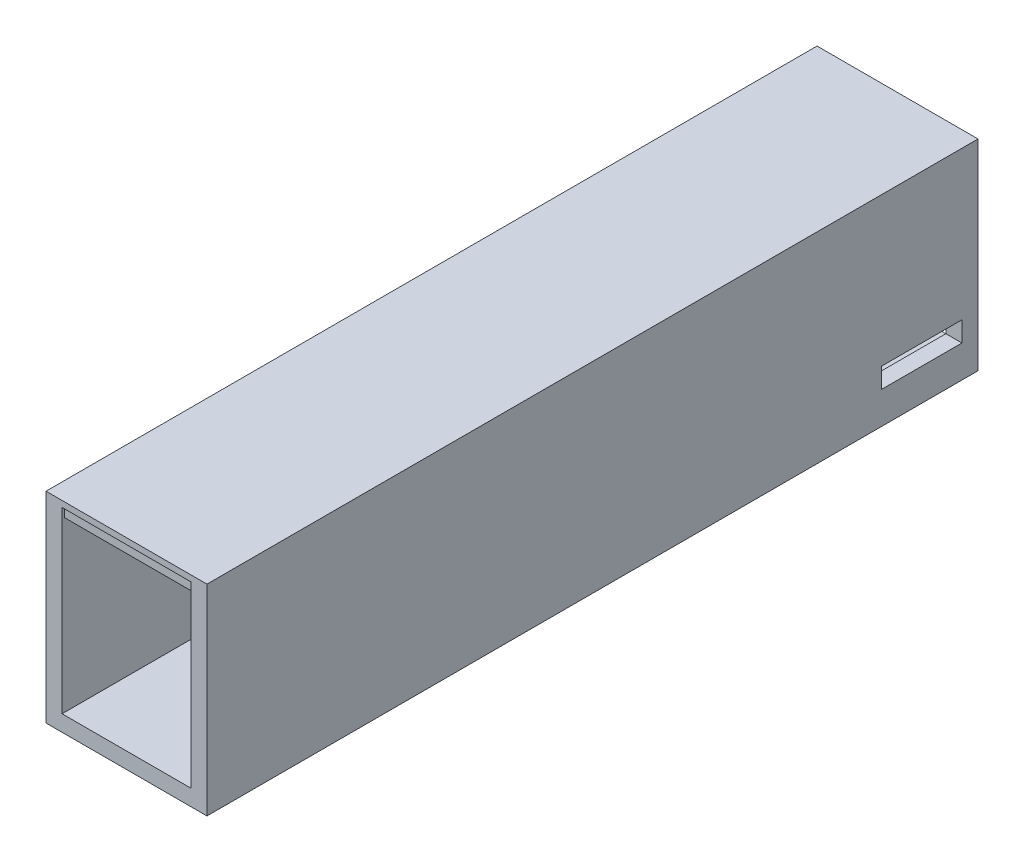
ISO-10303-21;
HEADER;
FILE_DESCRIPTION(('STEP AP214'),'2;1');
FILE_NAME('part.step','',(''),(''),'','','');
FILE_SCHEMA(('AUTOMOTIVE_DESIGN { 1 0 10303 214 1 1 1 1 }'));
ENDSEC;
DATA;
#1=APPLICATION_CONTEXT('core data for automotive mechanical design processes');
#2=APPLICATION_PROTOCOL_DEFINITION('international standard','automotive_design',2000,#1);
#3=PRODUCT_CONTEXT('',#1,'mechanical');
#4=PRODUCT('Part','Part','',(#3));
#5=PRODUCT_RELATED_PRODUCT_CATEGORY('part','',(#4));
#6=PRODUCT_DEFINITION_FORMATION('','',#4);
#7=PRODUCT_DEFINITION_CONTEXT('part definition',#1,'design');
#8=PRODUCT_DEFINITION('design','',#6,#7);
#9=PRODUCT_DEFINITION_SHAPE('','',#8);
#10=(LENGTH_UNIT() NAMED_UNIT(*) SI_UNIT(.MILLI.,.METRE.));
#11=(NAMED_UNIT(*) PLANE_ANGLE_UNIT() SI_UNIT($,.RADIAN.));
#12=(NAMED_UNIT(*) SI_UNIT($,.STERADIAN.) SOLID_ANGLE_UNIT());
#13=UNCERTAINTY_MEASURE_WITH_UNIT(LENGTH_MEASURE(1.E-05),#10,'distance_accuracy_value','');
#14=(GEOMETRIC_REPRESENTATION_CONTEXT(3) GLOBAL_UNCERTAINTY_ASSIGNED_CONTEXT((#13)) GLOBAL_UNIT_ASSIGNED_CONTEXT((#10,
#11,#12)) REPRESENTATION_CONTEXT('',''));
#15=CARTESIAN_POINT('',(0.,0.,0.));
#16=DIRECTION('',(0.,0.,1.));
#17=DIRECTION('',(1.,0.,0.));
#18=AXIS2_PLACEMENT_3D('',#15,#16,#17);
#19=CARTESIAN_POINT('',(-42.7005767012687,130.044257703081,480.));
#20=DIRECTION('',(0.,-1.,0.));
#21=DIRECTION('',(0.,0.,-1.));
#22=AXIS2_PLACEMENT_3D('',#19,#20,#21);
#23=PLANE('',#22);
#24=DIRECTION('',(0.,0.,-1.));
#25=VECTOR('',#24,1.);
#26=CARTESIAN_POINT('',(-42.7005767012687,130.044257703081,480.));
#27=LINE('',#26,#25);
#28=CARTESIAN_POINT('',(-42.7005767012687,130.044257703081,477.));
#29=VERTEX_POINT('',#28);
#30=CARTESIAN_POINT('',(-42.7005767012687,130.044257703081,-477.));
#31=VERTEX_POINT('',#30);
#32=EDGE_CURVE('E291',#29,#31,#27,.T.);
#33=ORIENTED_EDGE('',*,*,#32,.T.);
#34=DIRECTION('',(1.,0.,0.));
#35=VECTOR('',#34,1.);
#36=CARTESIAN_POINT('',(-42.7005767012687,130.044257703081,-477.));
#37=LINE('',#36,#35);
#38=CARTESIAN_POINT('',(117.699423298731,130.044257703081,-477.));
#39=VERTEX_POINT('',#38);
#40=EDGE_CURVE('E245',#31,#39,#37,.T.);
#41=ORIENTED_EDGE('',*,*,#40,.T.);
#42=DIRECTION('',(0.,0.,-1.));
#43=VECTOR('',#42,1.);
#44=CARTESIAN_POINT('',(117.699423298731,130.044257703081,480.));
#45=LINE('',#44,#43);
#46=CARTESIAN_POINT('',(117.699423298731,130.044257703081,477.));
#47=VERTEX_POINT('',#46);
#48=EDGE_CURVE('E278',#47,#39,#45,.T.);
#49=ORIENTED_EDGE('',*,*,#48,.F.);
#50=DIRECTION('',(-1.,0.,0.));
#51=VECTOR('',#50,1.);
#52=CARTESIAN_POINT('',(-42.7005767012687,130.044257703081,477.));
#53=LINE('',#52,#51);
#54=EDGE_CURVE('E264',#47,#29,#53,.T.);
#55=ORIENTED_EDGE('',*,*,#54,.T.);
#56=EDGE_LOOP('',(#33,#41,#49,#55));
#57=FACE_BOUND('',#56,.T.);
#58=ADVANCED_FACE('F37',(#57),#23,.T.);
#59=CARTESIAN_POINT('',(0.,0.,-480.));
#60=DIRECTION('',(0.,0.,1.));
#61=DIRECTION('',(1.,0.,0.));
#62=AXIS2_PLACEMENT_3D('',#59,#60,#61);
#63=PLANE('',#62);
#64=DIRECTION('',(-1.,0.,0.));
#65=VECTOR('',#64,1.);
#66=CARTESIAN_POINT('',(-62.7005767012687,150.044257703081,-480.));
#67=LINE('',#66,#65);
#68=CARTESIAN_POINT('',(137.699423298731,150.044257703081,-480.));
#69=VERTEX_POINT('',#68);
#70=CARTESIAN_POINT('',(-62.7005767012687,150.044257703081,-480.));
#71=VERTEX_POINT('',#70);
#72=EDGE_CURVE('E294',#69,#71,#67,.T.);
#73=ORIENTED_EDGE('',*,*,#72,.F.);
#74=DIRECTION('',(0.,1.,0.));
#75=VECTOR('',#74,1.);
#76=CARTESIAN_POINT('',(137.699423298731,-99.9557422969188,-480.));
#77=LINE('',#76,#75);
#78=CARTESIAN_POINT('',(137.699423298731,-99.9557422969188,-480.));
#79=VERTEX_POINT('',#78);
#80=EDGE_CURVE('E299',#79,#69,#77,.T.);
#81=ORIENTED_EDGE('',*,*,#80,.F.);
#82=DIRECTION('',(1.,0.,0.));
#83=VECTOR('',#82,1.);
#84=CARTESIAN_POINT('',(-62.7005767012687,-99.9557422969188,-480.));
#85=LINE('',#84,#83);
#86=CARTESIAN_POINT('',(-62.7005767012687,-99.9557422969188,-480.));
#87=VERTEX_POINT('',#86);
#88=EDGE_CURVE('E310',#87,#79,#85,.T.);
#89=ORIENTED_EDGE('',*,*,#88,.F.);
#90=DIRECTION('',(0.,-1.,0.));
#91=VECTOR('',#90,1.);
#92=CARTESIAN_POINT('',(-62.7005767012687,150.044257703081,-480.));
#93=LINE('',#92,#91);
#94=EDGE_CURVE('E308',#71,#87,#93,.T.);
#95=ORIENTED_EDGE('',*,*,#94,.F.);
#96=EDGE_LOOP('',(#73,#81,#89,#95));
#97=FACE_BOUND('',#96,.T.);
#98=DIRECTION('',(-1.,0.,0.));
#99=VECTOR('',#98,1.);
#100=CARTESIAN_POINT('',(-42.7005767012687,142.544257703081,-480.));
#101=LINE('',#100,#99);
#102=CARTESIAN_POINT('',(117.699423298731,142.544257703081,-480.));
#103=VERTEX_POINT('',#102);
#104=CARTESIAN_POINT('',(-42.7005767012687,142.544257703081,-480.));
#105=VERTEX_POINT('',#104);
#106=EDGE_CURVE('E231',#103,#105,#101,.T.);
#107=ORIENTED_EDGE('',*,*,#106,.T.);
#108=DIRECTION('',(0.,-1.,0.));
#109=VECTOR('',#108,1.);
#110=CARTESIAN_POINT('',(-42.7005767012687,130.044257703081,-480.));
#111=LINE('',#110,#109);
#112=CARTESIAN_POINT('',(-42.7005767012687,-79.9557422969188,-480.));
#113=VERTEX_POINT('',#112);
#114=EDGE_CURVE('E269',#105,#113,#111,.T.);
#115=ORIENTED_EDGE('',*,*,#114,.T.);
#116=DIRECTION('',(1.,0.,0.));
#117=VECTOR('',#116,1.);
#118=CARTESIAN_POINT('',(-42.7005767012687,-79.9557422969188,-480.));
#119=LINE('',#118,#117);
#120=CARTESIAN_POINT('',(117.699423298731,-79.9557422969188,-480.));
#121=VERTEX_POINT('',#120);
#122=EDGE_CURVE('E280',#113,#121,#119,.T.);
#123=ORIENTED_EDGE('',*,*,#122,.T.);
#124=DIRECTION('',(0.,1.,0.));
#125=VECTOR('',#124,1.);
#126=CARTESIAN_POINT('',(117.699423298731,-79.9557422969188,-480.));
#127=LINE('',#126,#125);
#128=EDGE_CURVE('E273',#121,#103,#127,.T.);
#129=ORIENTED_EDGE('',*,*,#128,.T.);
#130=EDGE_LOOP('',(#107,#115,#123,#129));
#131=FACE_BOUND('',#130,.T.);
#132=ADVANCED_FACE('F367',(#97,#131),#63,.F.);
#133=CARTESIAN_POINT('',(0.,0.,480.));
#134=DIRECTION('',(0.,0.,1.));
#135=DIRECTION('',(1.,0.,0.));
#136=AXIS2_PLACEMENT_3D('',#133,#134,#135);
#137=PLANE('',#136);
#138=DIRECTION('',(0.,-1.,0.));
#139=VECTOR('',#138,1.);
#140=CARTESIAN_POINT('',(-42.7005767012687,130.044257703081,480.));
#141=LINE('',#140,#139);
#142=CARTESIAN_POINT('',(-42.7005767012687,142.544257703081,480.));
#143=VERTEX_POINT('',#142);
#144=CARTESIAN_POINT('',(-42.7005767012687,-79.9557422969188,480.));
#145=VERTEX_POINT('',#144);
#146=EDGE_CURVE('E270',#143,#145,#141,.T.);
#147=ORIENTED_EDGE('',*,*,#146,.F.);
#148=DIRECTION('',(-1.,0.,0.));
#149=VECTOR('',#148,1.);
#150=CARTESIAN_POINT('',(-42.7005767012687,142.544257703081,480.));
#151=LINE('',#150,#149);
#152=CARTESIAN_POINT('',(117.699423298731,142.544257703081,480.));
#153=VERTEX_POINT('',#152);
#154=EDGE_CURVE('E250',#153,#143,#151,.T.);
#155=ORIENTED_EDGE('',*,*,#154,.F.);
#156=DIRECTION('',(0.,1.,0.));
#157=VECTOR('',#156,1.);
#158=CARTESIAN_POINT('',(117.699423298731,-79.9557422969188,480.));
#159=LINE('',#158,#157);
#160=CARTESIAN_POINT('',(117.699423298731,-79.9557422969188,480.));
#161=VERTEX_POINT('',#160);
#162=EDGE_CURVE('E276',#161,#153,#159,.T.);
#163=ORIENTED_EDGE('',*,*,#162,.F.);
#164=DIRECTION('',(1.,0.,0.));
#165=VECTOR('',#164,1.);
#166=CARTESIAN_POINT('',(-42.7005767012687,-79.9557422969188,480.));
#167=LINE('',#166,#165);
#168=EDGE_CURVE('E272',#145,#161,#167,.T.);
#169=ORIENTED_EDGE('',*,*,#168,.F.);
#170=EDGE_LOOP('',(#147,#155,#163,#169));
#171=FACE_BOUND('',#170,.T.);
#172=DIRECTION('',(-1.,0.,0.));
#173=VECTOR('',#172,1.);
#174=CARTESIAN_POINT('',(-62.7005767012687,150.044257703081,480.));
#175=LINE('',#174,#173);
#176=CARTESIAN_POINT('',(137.699423298731,150.044257703081,480.));
#177=VERTEX_POINT('',#176);
#178=CARTESIAN_POINT('',(-62.7005767012687,150.044257703081,480.));
#179=VERTEX_POINT('',#178);
#180=EDGE_CURVE('E295',#177,#179,#175,.T.);
#181=ORIENTED_EDGE('',*,*,#180,.T.);
#182=DIRECTION('',(0.,-1.,0.));
#183=VECTOR('',#182,1.);
#184=CARTESIAN_POINT('',(-62.7005767012687,150.044257703081,480.));
#185=LINE('',#184,#183);
#186=CARTESIAN_POINT('',(-62.7005767012687,-99.9557422969188,480.));
#187=VERTEX_POINT('',#186);
#188=EDGE_CURVE('E298',#179,#187,#185,.T.);
#189=ORIENTED_EDGE('',*,*,#188,.T.);
#190=DIRECTION('',(1.,0.,0.));
#191=VECTOR('',#190,1.);
#192=CARTESIAN_POINT('',(-62.7005767012687,-99.9557422969188,480.));
#193=LINE('',#192,#191);
#194=CARTESIAN_POINT('',(137.699423298731,-99.9557422969188,480.));
#195=VERTEX_POINT('',#194);
#196=EDGE_CURVE('E301',#187,#195,#193,.T.);
#197=ORIENTED_EDGE('',*,*,#196,.T.);
#198=DIRECTION('',(0.,1.,0.));
#199=VECTOR('',#198,1.);
#200=CARTESIAN_POINT('',(137.699423298731,-99.9557422969188,480.));
#201=LINE('',#200,#199);
#202=EDGE_CURVE('E303',#195,#177,#201,.T.);
#203=ORIENTED_EDGE('',*,*,#202,.T.);
#204=EDGE_LOOP('',(#181,#189,#197,#203));
#205=FACE_BOUND('',#204,.T.);
#206=ADVANCED_FACE('F373',(#171,#205),#137,.T.);
#207=CARTESIAN_POINT('',(-62.7005767012687,150.044257703081,480.));
#208=DIRECTION('',(0.,-1.,0.));
#209=DIRECTION('',(0.,0.,-1.));
#210=AXIS2_PLACEMENT_3D('',#207,#208,#209);
#211=PLANE('',#210);
#212=ORIENTED_EDGE('',*,*,#72,.T.);
#213=DIRECTION('',(0.,0.,-1.));
#214=VECTOR('',#213,1.);
#215=CARTESIAN_POINT('',(-62.7005767012687,150.044257703081,480.));
#216=LINE('',#215,#214);
#217=EDGE_CURVE('E321',#179,#71,#216,.T.);
#218=ORIENTED_EDGE('',*,*,#217,.F.);
#219=ORIENTED_EDGE('',*,*,#180,.F.);
#220=DIRECTION('',(0.,0.,-1.));
#221=VECTOR('',#220,1.);
#222=CARTESIAN_POINT('',(137.699423298731,150.044257703081,480.));
#223=LINE('',#222,#221);
#224=EDGE_CURVE('E305',#177,#69,#223,.T.);
#225=ORIENTED_EDGE('',*,*,#224,.T.);
#226=EDGE_LOOP('',(#212,#218,#219,#225));
#227=FACE_BOUND('',#226,.T.);
#228=ADVANCED_FACE('F39',(#227),#211,.F.);
#229=CARTESIAN_POINT('',(-62.7005767012687,150.044257703081,480.));
#230=DIRECTION('',(1.,0.,0.));
#231=DIRECTION('',(0.,0.,-1.));
#232=AXIS2_PLACEMENT_3D('',#229,#230,#231);
#233=PLANE('',#232);
#234=DIRECTION('',(0.,0.,1.));
#235=VECTOR('',#234,1.);
#236=CARTESIAN_POINT('',(-62.7005767012687,-34.9557422969188,-360.));
#237=LINE('',#236,#235);
#238=CARTESIAN_POINT('',(-62.7005767012687,-34.9557422969188,-460.));
#239=VERTEX_POINT('',#238);
#240=CARTESIAN_POINT('',(-62.7005767012687,-34.9557422969188,-360.));
#241=VERTEX_POINT('',#240);
#242=EDGE_CURVE('E210',#239,#241,#237,.T.);
#243=ORIENTED_EDGE('',*,*,#242,.T.);
#244=DIRECTION('',(0.,-1.,0.));
#245=VECTOR('',#244,1.);
#246=CARTESIAN_POINT('',(-62.7005767012687,-34.9557422969188,-360.));
#247=LINE('',#246,#245);
#248=CARTESIAN_POINT('',(-62.7005767012687,-59.9557422969188,-360.));
#249=VERTEX_POINT('',#248);
#250=EDGE_CURVE('E200',#241,#249,#247,.T.);
#251=ORIENTED_EDGE('',*,*,#250,.T.);
#252=DIRECTION('',(0.,0.,-1.));
#253=VECTOR('',#252,1.);
#254=CARTESIAN_POINT('',(-62.7005767012687,-59.9557422969188,-360.));
#255=LINE('',#254,#253);
#256=CARTESIAN_POINT('',(-62.7005767012687,-59.9557422969188,-460.));
#257=VERTEX_POINT('',#256);
#258=EDGE_CURVE('E206',#249,#257,#255,.T.);
#259=ORIENTED_EDGE('',*,*,#258,.T.);
#260=DIRECTION('',(0.,1.,0.));
#261=VECTOR('',#260,1.);
#262=CARTESIAN_POINT('',(-62.7005767012687,-34.9557422969188,-460.));
#263=LINE('',#262,#261);
#264=EDGE_CURVE('E52',#257,#239,#263,.T.);
#265=ORIENTED_EDGE('',*,*,#264,.T.);
#266=EDGE_LOOP('',(#243,#251,#259,#265));
#267=FACE_BOUND('',#266,.T.);
#268=ORIENTED_EDGE('',*,*,#94,.T.);
#269=DIRECTION('',(0.,0.,-1.));
#270=VECTOR('',#269,1.);
#271=CARTESIAN_POINT('',(-62.7005767012687,-99.9557422969188,480.));
#272=LINE('',#271,#270);
#273=EDGE_CURVE('E318',#187,#87,#272,.T.);
#274=ORIENTED_EDGE('',*,*,#273,.F.);
#275=ORIENTED_EDGE('',*,*,#188,.F.);
#276=ORIENTED_EDGE('',*,*,#217,.T.);
#277=EDGE_LOOP('',(#268,#274,#275,#276));
#278=FACE_BOUND('',#277,.T.);
#279=ADVANCED_FACE('F354',(#267,#278),#233,.F.);
#280=CARTESIAN_POINT('',(-62.7005767012687,-99.9557422969188,480.));
#281=DIRECTION('',(0.,1.,0.));
#282=DIRECTION('',(0.,0.,1.));
#283=AXIS2_PLACEMENT_3D('',#280,#281,#282);
#284=PLANE('',#283);
#285=CARTESIAN_POINT('',(112.499423298731,-99.9557422969188,0.));
#286=DIRECTION('',(0.,-1.,0.));
#287=DIRECTION('',(0.,0.,-1.));
#288=AXIS2_PLACEMENT_3D('',#285,#286,#287);
#289=CIRCLE('',#288,1.5);
#290=CARTESIAN_POINT('',(112.499423298731,-99.9557422969188,-1.49999999999997));
#291=VERTEX_POINT('',#290);
#292=EDGE_CURVE('E337',#291,#291,#289,.T.);
#293=ORIENTED_EDGE('',*,*,#292,.F.);
#294=EDGE_LOOP('',(#293));
#295=FACE_BOUND('',#294,.T.);
#296=CARTESIAN_POINT('',(-37.5005767012687,-99.9557422969188,0.));
#297=DIRECTION('',(0.,-1.,0.));
#298=DIRECTION('',(0.,0.,-1.));
#299=AXIS2_PLACEMENT_3D('',#296,#297,#298);
#300=CIRCLE('',#299,1.5);
#301=CARTESIAN_POINT('',(-37.5005767012687,-99.9557422969188,-1.5));
#302=VERTEX_POINT('',#301);
#303=EDGE_CURVE('E343',#302,#302,#300,.T.);
#304=ORIENTED_EDGE('',*,*,#303,.F.);
#305=EDGE_LOOP('',(#304));
#306=FACE_BOUND('',#305,.T.);
#307=ORIENTED_EDGE('',*,*,#88,.T.);
#308=DIRECTION('',(0.,0.,-1.));
#309=VECTOR('',#308,1.);
#310=CARTESIAN_POINT('',(137.699423298731,-99.9557422969188,480.));
#311=LINE('',#310,#309);
#312=EDGE_CURVE('E315',#195,#79,#311,.T.);
#313=ORIENTED_EDGE('',*,*,#312,.F.);
#314=ORIENTED_EDGE('',*,*,#196,.F.);
#315=ORIENTED_EDGE('',*,*,#273,.T.);
#316=EDGE_LOOP('',(#307,#313,#314,#315));
#317=FACE_BOUND('',#316,.T.);
#318=ADVANCED_FACE('F351',(#295,#306,#317),#284,.F.);
#319=CARTESIAN_POINT('',(137.699423298731,-99.9557422969188,480.));
#320=DIRECTION('',(-1.,0.,0.));
#321=DIRECTION('',(0.,0.,1.));
#322=AXIS2_PLACEMENT_3D('',#319,#320,#321);
#323=PLANE('',#322);
#324=DIRECTION('',(0.,0.,-1.));
#325=VECTOR('',#324,1.);
#326=CARTESIAN_POINT('',(137.699423298731,-59.9557422969188,-360.));
#327=LINE('',#326,#325);
#328=CARTESIAN_POINT('',(137.699423298731,-59.9557422969188,-360.));
#329=VERTEX_POINT('',#328);
#330=CARTESIAN_POINT('',(137.699423298731,-59.9557422969188,-460.));
#331=VERTEX_POINT('',#330);
#332=EDGE_CURVE('E190',#329,#331,#327,.T.);
#333=ORIENTED_EDGE('',*,*,#332,.F.);
#334=DIRECTION('',(0.,-1.,0.));
#335=VECTOR('',#334,1.);
#336=CARTESIAN_POINT('',(137.699423298731,-34.9557422969188,-360.));
#337=LINE('',#336,#335);
#338=CARTESIAN_POINT('',(137.699423298731,-34.9557422969188,-360.));
#339=VERTEX_POINT('',#338);
#340=EDGE_CURVE('E60',#339,#329,#337,.T.);
#341=ORIENTED_EDGE('',*,*,#340,.F.);
#342=DIRECTION('',(0.,0.,1.));
#343=VECTOR('',#342,1.);
#344=CARTESIAN_POINT('',(137.699423298731,-34.9557422969188,-360.));
#345=LINE('',#344,#343);
#346=CARTESIAN_POINT('',(137.699423298731,-34.9557422969188,-460.));
#347=VERTEX_POINT('',#346);
#348=EDGE_CURVE('E198',#347,#339,#345,.T.);
#349=ORIENTED_EDGE('',*,*,#348,.F.);
#350=DIRECTION('',(0.,1.,0.));
#351=VECTOR('',#350,1.);
#352=CARTESIAN_POINT('',(137.699423298731,-34.9557422969188,-460.));
#353=LINE('',#352,#351);
#354=EDGE_CURVE('E180',#331,#347,#353,.T.);
#355=ORIENTED_EDGE('',*,*,#354,.F.);
#356=EDGE_LOOP('',(#333,#341,#349,#355));
#357=FACE_BOUND('',#356,.T.);
#358=ORIENTED_EDGE('',*,*,#80,.T.);
#359=ORIENTED_EDGE('',*,*,#224,.F.);
#360=ORIENTED_EDGE('',*,*,#202,.F.);
#361=ORIENTED_EDGE('',*,*,#312,.T.);
#362=EDGE_LOOP('',(#358,#359,#360,#361));
#363=FACE_BOUND('',#362,.T.);
#364=ADVANCED_FACE('F195',(#357,#363),#323,.F.);
#365=CARTESIAN_POINT('',(-42.7005767012687,130.044257703081,480.));
#366=DIRECTION('',(1.,0.,0.));
#367=DIRECTION('',(0.,0.,-1.));
#368=AXIS2_PLACEMENT_3D('',#365,#366,#367);
#369=PLANE('',#368);
#370=DIRECTION('',(0.,-1.,0.));
#371=VECTOR('',#370,1.);
#372=CARTESIAN_POINT('',(-42.7005767012687,130.044257703081,-360.));
#373=LINE('',#372,#371);
#374=CARTESIAN_POINT('',(-42.7005767012687,-34.9557422969188,-360.));
#375=VERTEX_POINT('',#374);
#376=CARTESIAN_POINT('',(-42.7005767012687,-59.9557422969187,-360.));
#377=VERTEX_POINT('',#376);
#378=EDGE_CURVE('E228',#375,#377,#373,.T.);
#379=ORIENTED_EDGE('',*,*,#378,.F.);
#380=DIRECTION('',(0.,0.,1.));
#381=VECTOR('',#380,1.);
#382=CARTESIAN_POINT('',(-42.7005767012687,-34.9557422969187,480.));
#383=LINE('',#382,#381);
#384=CARTESIAN_POINT('',(-42.7005767012687,-34.9557422969188,-460.));
#385=VERTEX_POINT('',#384);
#386=EDGE_CURVE('E226',#385,#375,#383,.T.);
#387=ORIENTED_EDGE('',*,*,#386,.F.);
#388=DIRECTION('',(0.,1.,0.));
#389=VECTOR('',#388,1.);
#390=CARTESIAN_POINT('',(-42.7005767012687,130.044257703081,-460.));
#391=LINE('',#390,#389);
#392=CARTESIAN_POINT('',(-42.7005767012687,-59.9557422969188,-460.));
#393=VERTEX_POINT('',#392);
#394=EDGE_CURVE('E224',#393,#385,#391,.T.);
#395=ORIENTED_EDGE('',*,*,#394,.F.);
#396=DIRECTION('',(0.,0.,-1.));
#397=VECTOR('',#396,1.);
#398=CARTESIAN_POINT('',(-42.7005767012687,-59.9557422969187,480.));
#399=LINE('',#398,#397);
#400=EDGE_CURVE('E216',#377,#393,#399,.T.);
#401=ORIENTED_EDGE('',*,*,#400,.F.);
#402=EDGE_LOOP('',(#379,#387,#395,#401));
#403=FACE_BOUND('',#402,.T.);
#404=DIRECTION('',(0.,0.,-1.));
#405=VECTOR('',#404,1.);
#406=CARTESIAN_POINT('',(-42.7005767012687,-79.9557422969188,480.));
#407=LINE('',#406,#405);
#408=EDGE_CURVE('E288',#145,#113,#407,.T.);
#409=ORIENTED_EDGE('',*,*,#408,.T.);
#410=ORIENTED_EDGE('',*,*,#114,.F.);
#411=DIRECTION('',(0.,0.,-1.));
#412=VECTOR('',#411,1.);
#413=CARTESIAN_POINT('',(-42.7005767012687,142.544257703081,-477.));
#414=LINE('',#413,#412);
#415=CARTESIAN_POINT('',(-42.7005767012687,142.544257703081,-477.));
#416=VERTEX_POINT('',#415);
#417=EDGE_CURVE('E239',#416,#105,#414,.T.);
#418=ORIENTED_EDGE('',*,*,#417,.F.);
#419=DIRECTION('',(0.,-1.,0.));
#420=VECTOR('',#419,1.);
#421=CARTESIAN_POINT('',(-42.7005767012687,142.544257703081,-477.));
#422=LINE('',#421,#420);
#423=EDGE_CURVE('E232',#416,#31,#422,.T.);
#424=ORIENTED_EDGE('',*,*,#423,.T.);
#425=ORIENTED_EDGE('',*,*,#32,.F.);
#426=DIRECTION('',(0.,-1.,0.));
#427=VECTOR('',#426,1.);
#428=CARTESIAN_POINT('',(-42.7005767012687,142.544257703081,477.));
#429=LINE('',#428,#427);
#430=CARTESIAN_POINT('',(-42.7005767012687,142.544257703081,477.));
#431=VERTEX_POINT('',#430);
#432=EDGE_CURVE('E251',#431,#29,#429,.T.);
#433=ORIENTED_EDGE('',*,*,#432,.F.);
#434=DIRECTION('',(0.,0.,1.));
#435=VECTOR('',#434,1.);
#436=CARTESIAN_POINT('',(-42.7005767012687,142.544257703081,477.));
#437=LINE('',#436,#435);
#438=EDGE_CURVE('E261',#431,#143,#437,.T.);
#439=ORIENTED_EDGE('',*,*,#438,.T.);
#440=ORIENTED_EDGE('',*,*,#146,.T.);
#441=EDGE_LOOP('',(#409,#410,#418,#424,#425,#433,#439,#440));
#442=FACE_BOUND('',#441,.T.);
#443=ADVANCED_FACE('F389',(#403,#442),#369,.T.);
#444=CARTESIAN_POINT('',(-42.7005767012687,-79.9557422969188,480.));
#445=DIRECTION('',(0.,1.,0.));
#446=DIRECTION('',(0.,0.,1.));
#447=AXIS2_PLACEMENT_3D('',#444,#445,#446);
#448=PLANE('',#447);
#449=CARTESIAN_POINT('',(112.499423298731,-79.9557422969187,0.));
#450=DIRECTION('',(0.,-1.,0.));
#451=DIRECTION('',(0.,0.,-1.));
#452=AXIS2_PLACEMENT_3D('',#449,#450,#451);
#453=CIRCLE('',#452,1.5);
#454=CARTESIAN_POINT('',(112.499423298731,-79.9557422969187,-1.49999999999997));
#455=VERTEX_POINT('',#454);
#456=EDGE_CURVE('E335',#455,#455,#453,.T.);
#457=ORIENTED_EDGE('',*,*,#456,.T.);
#458=EDGE_LOOP('',(#457));
#459=FACE_BOUND('',#458,.T.);
#460=CARTESIAN_POINT('',(-37.5005767012687,-79.9557422969187,0.));
#461=DIRECTION('',(0.,-1.,0.));
#462=DIRECTION('',(0.,0.,-1.));
#463=AXIS2_PLACEMENT_3D('',#460,#461,#462);
#464=CIRCLE('',#463,1.5);
#465=CARTESIAN_POINT('',(-37.5005767012687,-79.9557422969187,-1.5));
#466=VERTEX_POINT('',#465);
#467=EDGE_CURVE('E340',#466,#466,#464,.T.);
#468=ORIENTED_EDGE('',*,*,#467,.T.);
#469=EDGE_LOOP('',(#468));
#470=FACE_BOUND('',#469,.T.);
#471=ORIENTED_EDGE('',*,*,#122,.F.);
#472=ORIENTED_EDGE('',*,*,#408,.F.);
#473=ORIENTED_EDGE('',*,*,#168,.T.);
#474=DIRECTION('',(0.,0.,-1.));
#475=VECTOR('',#474,1.);
#476=CARTESIAN_POINT('',(117.699423298731,-79.9557422969188,480.));
#477=LINE('',#476,#475);
#478=EDGE_CURVE('E286',#161,#121,#477,.T.);
#479=ORIENTED_EDGE('',*,*,#478,.T.);
#480=EDGE_LOOP('',(#471,#472,#473,#479));
#481=FACE_BOUND('',#480,.T.);
#482=ADVANCED_FACE('F398',(#459,#470,#481),#448,.T.);
#483=CARTESIAN_POINT('',(117.699423298731,-79.9557422969188,480.));
#484=DIRECTION('',(-1.,0.,0.));
#485=DIRECTION('',(0.,-1.,0.));
#486=AXIS2_PLACEMENT_3D('',#483,#484,#485);
#487=PLANE('',#486);
#488=DIRECTION('',(0.,1.,0.));
#489=VECTOR('',#488,1.);
#490=CARTESIAN_POINT('',(117.699423298731,-79.9557422969188,-360.));
#491=LINE('',#490,#489);
#492=CARTESIAN_POINT('',(117.699423298731,-59.9557422969188,-360.));
#493=VERTEX_POINT('',#492);
#494=CARTESIAN_POINT('',(117.699423298731,-34.9557422969188,-360.));
#495=VERTEX_POINT('',#494);
#496=EDGE_CURVE('E12',#493,#495,#491,.T.);
#497=ORIENTED_EDGE('',*,*,#496,.F.);
#498=DIRECTION('',(0.,0.,1.));
#499=VECTOR('',#498,1.);
#500=CARTESIAN_POINT('',(117.699423298731,-59.9557422969188,480.));
#501=LINE('',#500,#499);
#502=CARTESIAN_POINT('',(117.699423298731,-59.9557422969188,-460.));
#503=VERTEX_POINT('',#502);
#504=EDGE_CURVE('E324',#503,#493,#501,.T.);
#505=ORIENTED_EDGE('',*,*,#504,.F.);
#506=DIRECTION('',(0.,-1.,0.));
#507=VECTOR('',#506,1.);
#508=CARTESIAN_POINT('',(117.699423298731,-79.9557422969188,-460.));
#509=LINE('',#508,#507);
#510=CARTESIAN_POINT('',(117.699423298731,-34.9557422969188,-460.));
#511=VERTEX_POINT('',#510);
#512=EDGE_CURVE('E183',#511,#503,#509,.T.);
#513=ORIENTED_EDGE('',*,*,#512,.F.);
#514=DIRECTION('',(0.,0.,-1.));
#515=VECTOR('',#514,1.);
#516=CARTESIAN_POINT('',(117.699423298731,-34.9557422969188,480.));
#517=LINE('',#516,#515);
#518=EDGE_CURVE('E45',#495,#511,#517,.T.);
#519=ORIENTED_EDGE('',*,*,#518,.F.);
#520=EDGE_LOOP('',(#497,#505,#513,#519));
#521=FACE_BOUND('',#520,.T.);
#522=DIRECTION('',(0.,0.,-1.));
#523=VECTOR('',#522,1.);
#524=CARTESIAN_POINT('',(117.699423298731,142.544257703081,-477.));
#525=LINE('',#524,#523);
#526=CARTESIAN_POINT('',(117.699423298731,142.544257703081,-477.));
#527=VERTEX_POINT('',#526);
#528=EDGE_CURVE('E242',#527,#103,#525,.T.);
#529=ORIENTED_EDGE('',*,*,#528,.T.);
#530=ORIENTED_EDGE('',*,*,#128,.F.);
#531=ORIENTED_EDGE('',*,*,#478,.F.);
#532=ORIENTED_EDGE('',*,*,#162,.T.);
#533=DIRECTION('',(0.,0.,1.));
#534=VECTOR('',#533,1.);
#535=CARTESIAN_POINT('',(117.699423298731,142.544257703081,477.));
#536=LINE('',#535,#534);
#537=CARTESIAN_POINT('',(117.699423298731,142.544257703081,477.));
#538=VERTEX_POINT('',#537);
#539=EDGE_CURVE('E258',#538,#153,#536,.T.);
#540=ORIENTED_EDGE('',*,*,#539,.F.);
#541=DIRECTION('',(0.,1.,0.));
#542=VECTOR('',#541,1.);
#543=CARTESIAN_POINT('',(117.699423298731,142.544257703081,477.));
#544=LINE('',#543,#542);
#545=EDGE_CURVE('E253',#47,#538,#544,.T.);
#546=ORIENTED_EDGE('',*,*,#545,.F.);
#547=ORIENTED_EDGE('',*,*,#48,.T.);
#548=DIRECTION('',(0.,1.,0.));
#549=VECTOR('',#548,1.);
#550=CARTESIAN_POINT('',(117.699423298731,142.544257703081,-477.));
#551=LINE('',#550,#549);
#552=EDGE_CURVE('E237',#39,#527,#551,.T.);
#553=ORIENTED_EDGE('',*,*,#552,.T.);
#554=EDGE_LOOP('',(#529,#530,#531,#532,#540,#546,#547,#553));
#555=FACE_BOUND('',#554,.T.);
#556=ADVANCED_FACE('F332',(#521,#555),#487,.T.);
#557=CARTESIAN_POINT('',(-42.7005767012687,142.544257703081,477.));
#558=DIRECTION('',(0.,1.,0.));
#559=DIRECTION('',(0.,0.,1.));
#560=AXIS2_PLACEMENT_3D('',#557,#558,#559);
#561=PLANE('',#560);
#562=ORIENTED_EDGE('',*,*,#154,.T.);
#563=ORIENTED_EDGE('',*,*,#438,.F.);
#564=DIRECTION('',(-1.,0.,0.));
#565=VECTOR('',#564,1.);
#566=CARTESIAN_POINT('',(-42.7005767012687,142.544257703081,477.));
#567=LINE('',#566,#565);
#568=EDGE_CURVE('E255',#538,#431,#567,.T.);
#569=ORIENTED_EDGE('',*,*,#568,.F.);
#570=ORIENTED_EDGE('',*,*,#539,.T.);
#571=EDGE_LOOP('',(#562,#563,#569,#570));
#572=FACE_BOUND('',#571,.T.);
#573=ADVANCED_FACE('F432',(#572),#561,.F.);
#574=CARTESIAN_POINT('',(0.,0.,477.));
#575=DIRECTION('',(0.,0.,1.));
#576=DIRECTION('',(1.,0.,0.));
#577=AXIS2_PLACEMENT_3D('',#574,#575,#576);
#578=PLANE('',#577);
#579=ORIENTED_EDGE('',*,*,#545,.T.);
#580=ORIENTED_EDGE('',*,*,#568,.T.);
#581=ORIENTED_EDGE('',*,*,#432,.T.);
#582=ORIENTED_EDGE('',*,*,#54,.F.);
#583=EDGE_LOOP('',(#579,#580,#581,#582));
#584=FACE_BOUND('',#583,.T.);
#585=ADVANCED_FACE('F428',(#584),#578,.T.);
#586=CARTESIAN_POINT('',(-42.7005767012687,142.544257703081,-477.));
#587=DIRECTION('',(0.,-1.,0.));
#588=DIRECTION('',(0.,0.,-1.));
#589=AXIS2_PLACEMENT_3D('',#586,#587,#588);
#590=PLANE('',#589);
#591=ORIENTED_EDGE('',*,*,#106,.F.);
#592=ORIENTED_EDGE('',*,*,#528,.F.);
#593=DIRECTION('',(-1.,0.,0.));
#594=VECTOR('',#593,1.);
#595=CARTESIAN_POINT('',(-42.7005767012687,142.544257703081,-477.));
#596=LINE('',#595,#594);
#597=EDGE_CURVE('E235',#527,#416,#596,.T.);
#598=ORIENTED_EDGE('',*,*,#597,.T.);
#599=ORIENTED_EDGE('',*,*,#417,.T.);
#600=EDGE_LOOP('',(#591,#592,#598,#599));
#601=FACE_BOUND('',#600,.T.);
#602=ADVANCED_FACE('F417',(#601),#590,.T.);
#603=CARTESIAN_POINT('',(0.,0.,-477.));
#604=DIRECTION('',(0.,0.,-1.));
#605=DIRECTION('',(1.,0.,0.));
#606=AXIS2_PLACEMENT_3D('',#603,#604,#605);
#607=PLANE('',#606);
#608=ORIENTED_EDGE('',*,*,#423,.F.);
#609=ORIENTED_EDGE('',*,*,#597,.F.);
#610=ORIENTED_EDGE('',*,*,#552,.F.);
#611=ORIENTED_EDGE('',*,*,#40,.F.);
#612=EDGE_LOOP('',(#608,#609,#610,#611));
#613=FACE_BOUND('',#612,.T.);
#614=ADVANCED_FACE('F422',(#613),#607,.T.);
#615=CARTESIAN_POINT('',(-62.7005767012687,-59.9557422969188,-360.));
#616=DIRECTION('',(0.,-1.,0.));
#617=DIRECTION('',(0.,0.,-1.));
#618=AXIS2_PLACEMENT_3D('',#615,#616,#617);
#619=PLANE('',#618);
#620=ORIENTED_EDGE('',*,*,#504,.T.);
#621=DIRECTION('',(1.,0.,0.));
#622=VECTOR('',#621,1.);
#623=CARTESIAN_POINT('',(-62.7005767012687,-59.9557422969188,-360.));
#624=LINE('',#623,#622);
#625=EDGE_CURVE('E192',#493,#329,#624,.T.);
#626=ORIENTED_EDGE('',*,*,#625,.T.);
#627=ORIENTED_EDGE('',*,*,#332,.T.);
#628=DIRECTION('',(1.,0.,0.));
#629=VECTOR('',#628,1.);
#630=CARTESIAN_POINT('',(-62.7005767012687,-59.9557422969188,-460.));
#631=LINE('',#630,#629);
#632=EDGE_CURVE('E175',#503,#331,#631,.T.);
#633=ORIENTED_EDGE('',*,*,#632,.F.);
#634=EDGE_LOOP('',(#620,#626,#627,#633));
#635=FACE_BOUND('',#634,.T.);
#636=ADVANCED_FACE('F191',(#635),#619,.F.);
#637=CARTESIAN_POINT('',(-62.7005767012687,-34.9557422969188,-460.));
#638=DIRECTION('',(0.,0.,-1.));
#639=DIRECTION('',(-1.,0.,0.));
#640=AXIS2_PLACEMENT_3D('',#637,#638,#639);
#641=PLANE('',#640);
#642=ORIENTED_EDGE('',*,*,#512,.T.);
#643=ORIENTED_EDGE('',*,*,#632,.T.);
#644=ORIENTED_EDGE('',*,*,#354,.T.);
#645=DIRECTION('',(1.,0.,0.));
#646=VECTOR('',#645,1.);
#647=CARTESIAN_POINT('',(-62.7005767012687,-34.9557422969188,-460.));
#648=LINE('',#647,#646);
#649=EDGE_CURVE('E220',#511,#347,#648,.T.);
#650=ORIENTED_EDGE('',*,*,#649,.F.);
#651=EDGE_LOOP('',(#642,#643,#644,#650));
#652=FACE_BOUND('',#651,.T.);
#653=ADVANCED_FACE('F177',(#652),#641,.F.);
#654=CARTESIAN_POINT('',(-62.7005767012687,-34.9557422969188,-360.));
#655=DIRECTION('',(0.,1.,0.));
#656=DIRECTION('',(0.,0.,1.));
#657=AXIS2_PLACEMENT_3D('',#654,#655,#656);
#658=PLANE('',#657);
#659=ORIENTED_EDGE('',*,*,#518,.T.);
#660=ORIENTED_EDGE('',*,*,#649,.T.);
#661=ORIENTED_EDGE('',*,*,#348,.T.);
#662=DIRECTION('',(1.,0.,0.));
#663=VECTOR('',#662,1.);
#664=CARTESIAN_POINT('',(-62.7005767012687,-34.9557422969188,-360.));
#665=LINE('',#664,#663);
#666=EDGE_CURVE('E217',#495,#339,#665,.T.);
#667=ORIENTED_EDGE('',*,*,#666,.F.);
#668=EDGE_LOOP('',(#659,#660,#661,#667));
#669=FACE_BOUND('',#668,.T.);
#670=ADVANCED_FACE('F329',(#669),#658,.F.);
#671=CARTESIAN_POINT('',(-62.7005767012687,-34.9557422969188,-360.));
#672=DIRECTION('',(0.,0.,1.));
#673=DIRECTION('',(1.,0.,0.));
#674=AXIS2_PLACEMENT_3D('',#671,#672,#673);
#675=PLANE('',#674);
#676=ORIENTED_EDGE('',*,*,#496,.T.);
#677=ORIENTED_EDGE('',*,*,#666,.T.);
#678=ORIENTED_EDGE('',*,*,#340,.T.);
#679=ORIENTED_EDGE('',*,*,#625,.F.);
#680=EDGE_LOOP('',(#676,#677,#678,#679));
#681=FACE_BOUND('',#680,.T.);
#682=ADVANCED_FACE('F334',(#681),#675,.F.);
#683=ORIENTED_EDGE('',*,*,#378,.T.);
#684=EDGE_CURVE('E187',#249,#377,#624,.T.);
#685=ORIENTED_EDGE('',*,*,#684,.F.);
#686=ORIENTED_EDGE('',*,*,#250,.F.);
#687=EDGE_CURVE('E213',#241,#375,#665,.T.);
#688=ORIENTED_EDGE('',*,*,#687,.T.);
#689=EDGE_LOOP('',(#683,#685,#686,#688));
#690=FACE_BOUND('',#689,.T.);
#691=ADVANCED_FACE('F449',(#690),#675,.F.);
#692=ORIENTED_EDGE('',*,*,#386,.T.);
#693=ORIENTED_EDGE('',*,*,#687,.F.);
#694=ORIENTED_EDGE('',*,*,#242,.F.);
#695=EDGE_CURVE('E218',#239,#385,#648,.T.);
#696=ORIENTED_EDGE('',*,*,#695,.T.);
#697=EDGE_LOOP('',(#692,#693,#694,#696));
#698=FACE_BOUND('',#697,.T.);
#699=ADVANCED_FACE('F458',(#698),#658,.F.);
#700=ORIENTED_EDGE('',*,*,#394,.T.);
#701=ORIENTED_EDGE('',*,*,#695,.F.);
#702=ORIENTED_EDGE('',*,*,#264,.F.);
#703=EDGE_CURVE('E186',#257,#393,#631,.T.);
#704=ORIENTED_EDGE('',*,*,#703,.T.);
#705=EDGE_LOOP('',(#700,#701,#702,#704));
#706=FACE_BOUND('',#705,.T.);
#707=ADVANCED_FACE('F455',(#706),#641,.F.);
#708=ORIENTED_EDGE('',*,*,#400,.T.);
#709=ORIENTED_EDGE('',*,*,#703,.F.);
#710=ORIENTED_EDGE('',*,*,#258,.F.);
#711=ORIENTED_EDGE('',*,*,#684,.T.);
#712=EDGE_LOOP('',(#708,#709,#710,#711));
#713=FACE_BOUND('',#712,.T.);
#714=ADVANCED_FACE('F452',(#713),#619,.F.);
#715=CARTESIAN_POINT('',(-37.5005767012687,-79.9557422969187,0.));
#716=DIRECTION('',(0.,-1.,0.));
#717=DIRECTION('',(0.,0.,-1.));
#718=AXIS2_PLACEMENT_3D('',#715,#716,#717);
#719=CYLINDRICAL_SURFACE('',#718,1.5);
#720=ORIENTED_EDGE('',*,*,#467,.F.);
#721=EDGE_LOOP('',(#720));
#722=FACE_BOUND('',#721,.T.);
#723=ORIENTED_EDGE('',*,*,#303,.T.);
#724=EDGE_LOOP('',(#723));
#725=FACE_BOUND('',#724,.T.);
#726=ADVANCED_FACE('F459',(#722,#725),#719,.F.);
#727=CARTESIAN_POINT('',(112.499423298731,-79.9557422969187,0.));
#728=DIRECTION('',(0.,-1.,0.));
#729=DIRECTION('',(0.,0.,-1.));
#730=AXIS2_PLACEMENT_3D('',#727,#728,#729);
#731=CYLINDRICAL_SURFACE('',#730,1.5);
#732=ORIENTED_EDGE('',*,*,#456,.F.);
#733=EDGE_LOOP('',(#732));
#734=FACE_BOUND('',#733,.T.);
#735=ORIENTED_EDGE('',*,*,#292,.T.);
#736=EDGE_LOOP('',(#735));
#737=FACE_BOUND('',#736,.T.);
#738=ADVANCED_FACE('F349',(#734,#737),#731,.F.);
#739=CLOSED_SHELL('',(#58,#132,#206,#228,#279,#318,#364,#443,#482,#556,#573,#585,#602,#614,#636,
#653,#670,#682,#691,#699,#707,#714,#726,#738));
#740=MANIFOLD_SOLID_BREP('B2',#739);
#741=ADVANCED_BREP_SHAPE_REPRESENTATION('',(#18,#740),#14);
#742=SHAPE_DEFINITION_REPRESENTATION(#9,#741);
ENDSEC;
END-ISO-10303-21;
